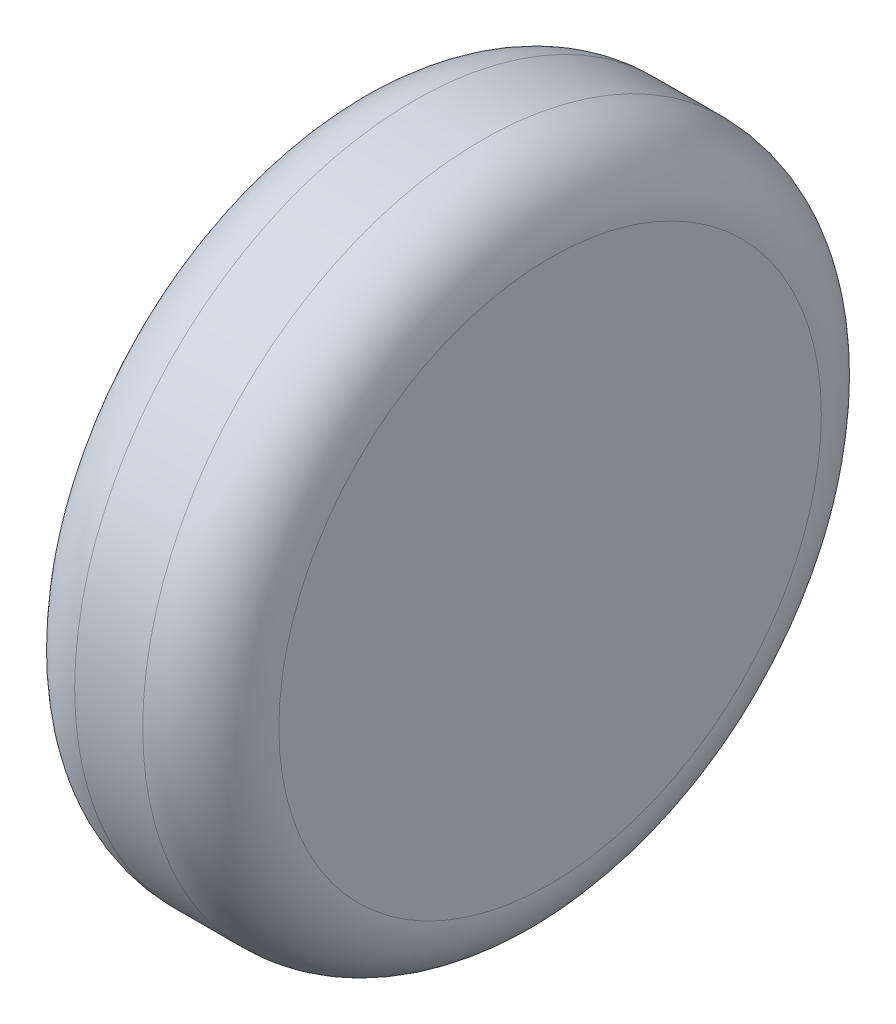
ISO-10303-21;
HEADER;
FILE_DESCRIPTION(('STEP AP214'),'2;1');
FILE_NAME('part.step','',(''),(''),'','','');
FILE_SCHEMA(('AUTOMOTIVE_DESIGN { 1 0 10303 214 1 1 1 1 }'));
ENDSEC;
DATA;
#1=APPLICATION_CONTEXT('core data for automotive mechanical design processes');
#2=APPLICATION_PROTOCOL_DEFINITION('international standard','automotive_design',2000,#1);
#3=PRODUCT_CONTEXT('',#1,'mechanical');
#4=PRODUCT('Part','Part','',(#3));
#5=PRODUCT_RELATED_PRODUCT_CATEGORY('part','',(#4));
#6=PRODUCT_DEFINITION_FORMATION('','',#4);
#7=PRODUCT_DEFINITION_CONTEXT('part definition',#1,'design');
#8=PRODUCT_DEFINITION('design','',#6,#7);
#9=PRODUCT_DEFINITION_SHAPE('','',#8);
#10=(LENGTH_UNIT() NAMED_UNIT(*) SI_UNIT(.MILLI.,.METRE.));
#11=(NAMED_UNIT(*) PLANE_ANGLE_UNIT() SI_UNIT($,.RADIAN.));
#12=(NAMED_UNIT(*) SI_UNIT($,.STERADIAN.) SOLID_ANGLE_UNIT());
#13=UNCERTAINTY_MEASURE_WITH_UNIT(LENGTH_MEASURE(1.E-05),#10,'distance_accuracy_value','');
#14=(GEOMETRIC_REPRESENTATION_CONTEXT(3) GLOBAL_UNCERTAINTY_ASSIGNED_CONTEXT((#13)) GLOBAL_UNIT_ASSIGNED_CONTEXT((#10,
#11,#12)) REPRESENTATION_CONTEXT('',''));
#15=CARTESIAN_POINT('',(0.,0.,0.));
#16=DIRECTION('',(0.,0.,1.));
#17=DIRECTION('',(1.,0.,0.));
#18=AXIS2_PLACEMENT_3D('',#15,#16,#17);
#19=CARTESIAN_POINT('',(38.1,0.,0.));
#20=DIRECTION('',(-1.,0.,0.));
#21=DIRECTION('',(0.,0.,1.));
#22=AXIS2_PLACEMENT_3D('',#19,#20,#21);
#23=CYLINDRICAL_SURFACE('',#22,63.2968);
#24=CARTESIAN_POINT('',(25.4,0.,0.));
#25=DIRECTION('',(1.,0.,0.));
#26=DIRECTION('',(0.,0.,-1.));
#27=AXIS2_PLACEMENT_3D('',#24,#25,#26);
#28=CIRCLE('',#27,63.2968);
#29=CARTESIAN_POINT('',(25.4,0.,63.2968));
#30=VERTEX_POINT('',#29);
#31=EDGE_CURVE('E45',#30,#30,#28,.F.);
#32=CARTESIAN_POINT('',(12.7,0.,0.));
#33=DIRECTION('',(1.,0.,0.));
#34=DIRECTION('',(0.,0.,-1.));
#35=AXIS2_PLACEMENT_3D('',#32,#33,#34);
#36=CIRCLE('',#35,63.2968);
#37=CARTESIAN_POINT('',(12.7,0.,63.2968));
#38=VERTEX_POINT('',#37);
#39=EDGE_CURVE('E50',#38,#38,#36,.T.);
#40=CARTESIAN_POINT('',(25.4,0.,63.2968));
#41=CARTESIAN_POINT('',(25.2677083333333,0.,63.2968));
#42=CARTESIAN_POINT('',(25.1354166666667,0.,63.2968));
#43=CARTESIAN_POINT('',(24.8708333333333,0.,63.2968));
#44=CARTESIAN_POINT('',(24.7385416666667,0.,63.2968));
#45=CARTESIAN_POINT('',(24.4739583333333,0.,63.2968));
#46=CARTESIAN_POINT('',(24.3416666666667,0.,63.2968));
#47=CARTESIAN_POINT('',(24.0770833333333,0.,63.2968));
#48=CARTESIAN_POINT('',(23.9447916666667,0.,63.2968));
#49=CARTESIAN_POINT('',(23.6802083333333,0.,63.2968));
#50=CARTESIAN_POINT('',(23.5479166666667,0.,63.2968));
#51=CARTESIAN_POINT('',(23.2833333333333,0.,63.2968));
#52=CARTESIAN_POINT('',(23.1510416666667,0.,63.2968));
#53=CARTESIAN_POINT('',(22.8864583333333,0.,63.2968));
#54=CARTESIAN_POINT('',(22.7541666666667,0.,63.2968));
#55=CARTESIAN_POINT('',(22.4895833333333,0.,63.2968));
#56=CARTESIAN_POINT('',(22.3572916666667,0.,63.2968));
#57=CARTESIAN_POINT('',(22.0927083333333,0.,63.2968));
#58=CARTESIAN_POINT('',(21.9604166666667,0.,63.2968));
#59=CARTESIAN_POINT('',(21.6958333333333,0.,63.2968));
#60=CARTESIAN_POINT('',(21.5635416666667,0.,63.2968));
#61=CARTESIAN_POINT('',(21.2989583333333,0.,63.2968));
#62=CARTESIAN_POINT('',(21.1666666666667,0.,63.2968));
#63=CARTESIAN_POINT('',(20.9020833333333,0.,63.2968));
#64=CARTESIAN_POINT('',(20.7697916666667,0.,63.2968));
#65=CARTESIAN_POINT('',(20.5052083333333,0.,63.2968));
#66=CARTESIAN_POINT('',(20.3729166666667,0.,63.2968));
#67=CARTESIAN_POINT('',(20.1083333333333,0.,63.2968));
#68=CARTESIAN_POINT('',(19.9760416666667,0.,63.2968));
#69=CARTESIAN_POINT('',(19.7114583333333,0.,63.2968));
#70=CARTESIAN_POINT('',(19.5791666666667,0.,63.2968));
#71=CARTESIAN_POINT('',(19.3145833333333,0.,63.2968));
#72=CARTESIAN_POINT('',(19.1822916666667,0.,63.2968));
#73=CARTESIAN_POINT('',(18.9177083333333,0.,63.2968));
#74=CARTESIAN_POINT('',(18.7854166666667,0.,63.2968));
#75=CARTESIAN_POINT('',(18.5208333333333,0.,63.2968));
#76=CARTESIAN_POINT('',(18.3885416666667,0.,63.2968));
#77=CARTESIAN_POINT('',(18.1239583333333,0.,63.2968));
#78=CARTESIAN_POINT('',(17.9916666666667,0.,63.2968));
#79=CARTESIAN_POINT('',(17.7270833333333,0.,63.2968));
#80=CARTESIAN_POINT('',(17.5947916666667,0.,63.2968));
#81=CARTESIAN_POINT('',(17.3302083333333,0.,63.2968));
#82=CARTESIAN_POINT('',(17.1979166666667,0.,63.2968));
#83=CARTESIAN_POINT('',(16.9333333333333,0.,63.2968));
#84=CARTESIAN_POINT('',(16.8010416666667,0.,63.2968));
#85=CARTESIAN_POINT('',(16.5364583333333,0.,63.2968));
#86=CARTESIAN_POINT('',(16.4041666666667,0.,63.2968));
#87=CARTESIAN_POINT('',(16.1395833333333,0.,63.2968));
#88=CARTESIAN_POINT('',(16.0072916666667,0.,63.2968));
#89=CARTESIAN_POINT('',(15.7427083333333,0.,63.2968));
#90=CARTESIAN_POINT('',(15.6104166666667,0.,63.2968));
#91=CARTESIAN_POINT('',(15.3458333333333,0.,63.2968));
#92=CARTESIAN_POINT('',(15.2135416666667,0.,63.2968));
#93=CARTESIAN_POINT('',(14.9489583333333,0.,63.2968));
#94=CARTESIAN_POINT('',(14.8166666666667,0.,63.2968));
#95=CARTESIAN_POINT('',(14.5520833333333,0.,63.2968));
#96=CARTESIAN_POINT('',(14.4197916666667,0.,63.2968));
#97=CARTESIAN_POINT('',(14.1552083333333,0.,63.2968));
#98=CARTESIAN_POINT('',(14.0229166666667,0.,63.2968));
#99=CARTESIAN_POINT('',(13.7583333333333,0.,63.2968));
#100=CARTESIAN_POINT('',(13.6260416666667,0.,63.2968));
#101=CARTESIAN_POINT('',(13.3614583333333,0.,63.2968));
#102=CARTESIAN_POINT('',(13.2291666666667,0.,63.2968));
#103=CARTESIAN_POINT('',(12.9645833333333,0.,63.2968));
#104=CARTESIAN_POINT('',(12.8322916666667,0.,63.2968));
#105=CARTESIAN_POINT('',(12.7,0.,63.2968));
#106=B_SPLINE_CURVE_WITH_KNOTS('',3,(#40,#41,#42,#43,#44,#45,#46,#47,#48,#49,#50,#51,#52,#53,
#54,#55,#56,#57,#58,#59,#60,#61,#62,#63,#64,#65,#66,#67,#68,#69,#70,#71,#72,#73,#74,#75,#76,#77,
#78,#79,#80,#81,#82,#83,#84,#85,#86,#87,#88,#89,#90,#91,#92,#93,#94,#95,#96,#97,#98,#99,#100,
#101,#102,#103,#104,#105),.UNSPECIFIED.,.F.,.F.,(4,2,2,2,2,2,2,2,2,2,2,2,2,2,2,2,2,2,2,2,2,2,2,
2,2,2,2,2,2,2,2,2,4),(0.,0.396874999999998,0.793749999999999,1.190625,1.5875,1.984375,2.38125,
2.778125,3.175,3.571875,3.96875,4.365625,4.7625,5.159375,5.55625,5.953125,6.35,6.746875,7.14375,
7.540625,7.9375,8.334375,8.73125,9.128125,9.525,9.921875,10.31875,10.715625,11.1125,11.509375,
11.90625,12.303125,12.7),.UNSPECIFIED.);
#107=EDGE_CURVE('BSEAM37',#30,#38,#106,.T.);
#108=ORIENTED_EDGE('',*,*,#31,.T.);
#109=ORIENTED_EDGE('',*,*,#39,.T.);
#110=ORIENTED_EDGE('',*,*,#107,.T.);
#111=ORIENTED_EDGE('',*,*,#107,.F.);
#112=EDGE_LOOP('',(#108,#110,#109,#111));
#113=FACE_BOUND('',#112,.T.);
#114=ADVANCED_FACE('F37',(#113),#23,.T.);
#115=CARTESIAN_POINT('',(38.1,0.,0.));
#116=DIRECTION('',(1.,0.,0.));
#117=DIRECTION('',(0.,0.,-1.));
#118=AXIS2_PLACEMENT_3D('',#115,#116,#117);
#119=PLANE('',#118);
#120=CARTESIAN_POINT('',(38.1,0.,0.));
#121=DIRECTION('',(1.,0.,0.));
#122=DIRECTION('',(0.,0.,-1.));
#123=AXIS2_PLACEMENT_3D('',#120,#121,#122);
#124=CIRCLE('',#123,50.5968);
#125=CARTESIAN_POINT('',(38.1,0.,-50.5968));
#126=VERTEX_POINT('',#125);
#127=EDGE_CURVE('E55',#126,#126,#124,.T.);
#128=ORIENTED_EDGE('',*,*,#127,.T.);
#129=EDGE_LOOP('',(#128));
#130=FACE_BOUND('',#129,.T.);
#131=ADVANCED_FACE('F62',(#130),#119,.T.);
#132=CARTESIAN_POINT('',(0.,0.,0.));
#133=DIRECTION('',(1.,0.,0.));
#134=DIRECTION('',(0.,0.,-1.));
#135=AXIS2_PLACEMENT_3D('',#132,#133,#134);
#136=PLANE('',#135);
#137=CARTESIAN_POINT('',(0.,0.,0.));
#138=DIRECTION('',(1.,0.,0.));
#139=DIRECTION('',(0.,0.,-1.));
#140=AXIS2_PLACEMENT_3D('',#137,#138,#139);
#141=CIRCLE('',#140,50.5968);
#142=CARTESIAN_POINT('',(0.,0.,-50.5968));
#143=VERTEX_POINT('',#142);
#144=EDGE_CURVE('E10',#143,#143,#141,.F.);
#145=ORIENTED_EDGE('',*,*,#144,.T.);
#146=EDGE_LOOP('',(#145));
#147=FACE_BOUND('',#146,.T.);
#148=ADVANCED_FACE('F66',(#147),#136,.F.);
#149=CARTESIAN_POINT('',(25.4,0.,0.));
#150=DIRECTION('',(1.,0.,0.));
#151=DIRECTION('',(0.,0.,-1.));
#152=AXIS2_PLACEMENT_3D('',#149,#150,#151);
#153=TOROIDAL_SURFACE('',#152,50.5968,12.7);
#154=ORIENTED_EDGE('',*,*,#31,.F.);
#155=EDGE_LOOP('',(#154));
#156=FACE_BOUND('',#155,.T.);
#157=ORIENTED_EDGE('',*,*,#127,.F.);
#158=EDGE_LOOP('',(#157));
#159=FACE_BOUND('',#158,.T.);
#160=ADVANCED_FACE('F64',(#156,#159),#153,.T.);
#161=CARTESIAN_POINT('',(12.7,0.,0.));
#162=DIRECTION('',(1.,0.,0.));
#163=DIRECTION('',(0.,0.,-1.));
#164=AXIS2_PLACEMENT_3D('',#161,#162,#163);
#165=TOROIDAL_SURFACE('',#164,50.5968,12.7);
#166=ORIENTED_EDGE('',*,*,#144,.F.);
#167=EDGE_LOOP('',(#166));
#168=FACE_BOUND('',#167,.T.);
#169=ORIENTED_EDGE('',*,*,#39,.F.);
#170=EDGE_LOOP('',(#169));
#171=FACE_BOUND('',#170,.T.);
#172=ADVANCED_FACE('F39',(#168,#171),#165,.T.);
#173=CLOSED_SHELL('',(#114,#131,#148,#160,#172));
#174=MANIFOLD_SOLID_BREP('B2',#173);
#175=ADVANCED_BREP_SHAPE_REPRESENTATION('',(#18,#174),#14);
#176=SHAPE_DEFINITION_REPRESENTATION(#9,#175);
ENDSEC;
END-ISO-10303-21;
